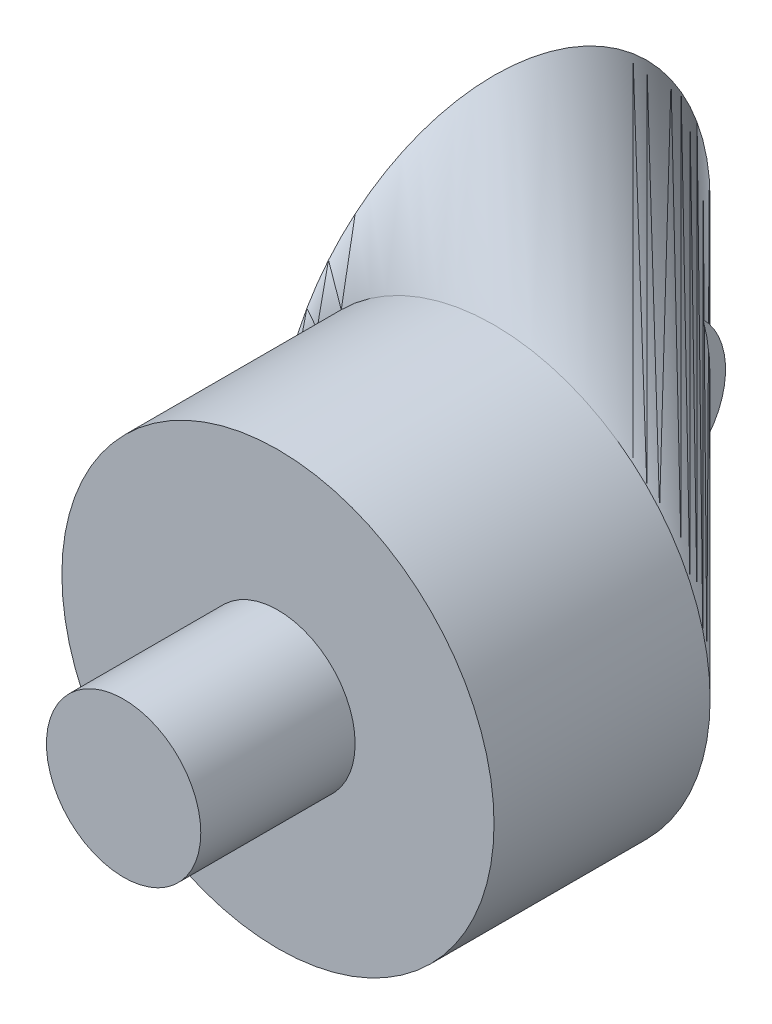
ISO-10303-21;
HEADER;
FILE_DESCRIPTION(('STEP AP214'),'2;1');
FILE_NAME('part.step','',(''),(''),'','','');
FILE_SCHEMA(('AUTOMOTIVE_DESIGN { 1 0 10303 214 1 1 1 1 }'));
ENDSEC;
DATA;
#1=APPLICATION_CONTEXT('core data for automotive mechanical design processes');
#2=APPLICATION_PROTOCOL_DEFINITION('international standard','automotive_design',2000,#1);
#3=PRODUCT_CONTEXT('',#1,'mechanical');
#4=PRODUCT('Part','Part','',(#3));
#5=PRODUCT_RELATED_PRODUCT_CATEGORY('part','',(#4));
#6=PRODUCT_DEFINITION_FORMATION('','',#4);
#7=PRODUCT_DEFINITION_CONTEXT('part definition',#1,'design');
#8=PRODUCT_DEFINITION('design','',#6,#7);
#9=PRODUCT_DEFINITION_SHAPE('','',#8);
#10=(LENGTH_UNIT() NAMED_UNIT(*) SI_UNIT(.MILLI.,.METRE.));
#11=(NAMED_UNIT(*) PLANE_ANGLE_UNIT() SI_UNIT($,.RADIAN.));
#12=(NAMED_UNIT(*) SI_UNIT($,.STERADIAN.) SOLID_ANGLE_UNIT());
#13=UNCERTAINTY_MEASURE_WITH_UNIT(LENGTH_MEASURE(1.E-05),#10,'distance_accuracy_value','');
#14=(GEOMETRIC_REPRESENTATION_CONTEXT(3) GLOBAL_UNCERTAINTY_ASSIGNED_CONTEXT((#13)) GLOBAL_UNIT_ASSIGNED_CONTEXT((#10,
#11,#12)) REPRESENTATION_CONTEXT('',''));
#15=CARTESIAN_POINT('',(0.,0.,0.));
#16=DIRECTION('',(0.,0.,1.));
#17=DIRECTION('',(1.,0.,0.));
#18=AXIS2_PLACEMENT_3D('',#15,#16,#17);
#19=CARTESIAN_POINT('',(0.,0.,0.));
#20=DIRECTION('',(1.,0.,0.));
#21=DIRECTION('',(0.,0.,-1.));
#22=AXIS2_PLACEMENT_3D('',#19,#20,#21);
#23=PLANE('',#22);
#24=CARTESIAN_POINT('',(0.,0.,0.));
#25=DIRECTION('',(-1.,0.,0.));
#26=DIRECTION('',(0.,0.,1.));
#27=AXIS2_PLACEMENT_3D('',#24,#25,#26);
#28=CIRCLE('',#27,25.);
#29=CARTESIAN_POINT('',(0.,0.,25.));
#30=VERTEX_POINT('',#29);
#31=EDGE_CURVE('E56',#30,#30,#28,.T.);
#32=ORIENTED_EDGE('',*,*,#31,.F.);
#33=EDGE_LOOP('',(#32));
#34=FACE_BOUND('',#33,.T.);
#35=CARTESIAN_POINT('',(0.,0.,0.));
#36=DIRECTION('',(1.,0.,0.));
#37=DIRECTION('',(0.,0.,-1.));
#38=AXIS2_PLACEMENT_3D('',#35,#36,#37);
#39=CIRCLE('',#38,70.);
#40=CARTESIAN_POINT('',(0.,0.,70.));
#41=VERTEX_POINT('',#40);
#42=EDGE_CURVE('E42',#41,#41,#39,.T.);
#43=ORIENTED_EDGE('',*,*,#42,.F.);
#44=EDGE_LOOP('',(#43));
#45=FACE_BOUND('',#44,.T.);
#46=ADVANCED_FACE('F35',(#34,#45),#23,.F.);
#47=CARTESIAN_POINT('',(0.,0.,70.));
#48=DIRECTION('',(0.,1.,0.));
#49=DIRECTION('',(0.,0.,1.));
#50=AXIS2_PLACEMENT_3D('',#47,#48,#49);
#51=DEGENERATE_TOROIDAL_SURFACE('',#50,70.,70.,.T.);
#52=ORIENTED_EDGE('',*,*,#42,.T.);
#53=CARTESIAN_POINT('',(70.,0.,70.));
#54=DIRECTION('',(0.,0.,1.));
#55=DIRECTION('',(1.,0.,0.));
#56=AXIS2_PLACEMENT_3D('',#53,#54,#55);
#57=CIRCLE('',#56,70.);
#58=EDGE_CURVE('E49',#41,#41,#57,.T.);
#59=ORIENTED_EDGE('',*,*,#58,.F.);
#60=EDGE_LOOP('',(#52,#59));
#61=FACE_BOUND('',#60,.T.);
#62=ADVANCED_FACE('F87',(#61),#51,.T.);
#63=CARTESIAN_POINT('',(50.,0.,0.));
#64=DIRECTION('',(-1.,0.,0.));
#65=DIRECTION('',(0.,0.,1.));
#66=AXIS2_PLACEMENT_3D('',#63,#64,#65);
#67=CYLINDRICAL_SURFACE('',#66,25.);
#68=CARTESIAN_POINT('',(50.,0.,0.));
#69=DIRECTION('',(-1.,0.,0.));
#70=DIRECTION('',(0.,0.,1.));
#71=AXIS2_PLACEMENT_3D('',#68,#69,#70);
#72=CIRCLE('',#71,25.);
#73=CARTESIAN_POINT('',(50.,0.,25.));
#74=VERTEX_POINT('',#73);
#75=EDGE_CURVE('E51',#74,#74,#72,.T.);
#76=ORIENTED_EDGE('',*,*,#75,.F.);
#77=EDGE_LOOP('',(#76));
#78=FACE_BOUND('',#77,.T.);
#79=ORIENTED_EDGE('',*,*,#31,.T.);
#80=EDGE_LOOP('',(#79));
#81=FACE_BOUND('',#80,.T.);
#82=ADVANCED_FACE('F89',(#78,#81),#67,.F.);
#83=CARTESIAN_POINT('',(50.,0.,0.));
#84=DIRECTION('',(-1.,0.,0.));
#85=DIRECTION('',(0.,0.,1.));
#86=AXIS2_PLACEMENT_3D('',#83,#84,#85);
#87=PLANE('',#86);
#88=ORIENTED_EDGE('',*,*,#75,.T.);
#89=EDGE_LOOP('',(#88));
#90=FACE_BOUND('',#89,.T.);
#91=ADVANCED_FACE('F85',(#90),#87,.T.);
#92=CARTESIAN_POINT('',(70.,0.,140.));
#93=DIRECTION('',(0.,0.,-1.));
#94=DIRECTION('',(-1.,0.,0.));
#95=AXIS2_PLACEMENT_3D('',#92,#93,#94);
#96=CYLINDRICAL_SURFACE('',#95,70.);
#97=CARTESIAN_POINT('',(70.,0.,140.));
#98=DIRECTION('',(0.,0.,1.));
#99=DIRECTION('',(1.,0.,0.));
#100=AXIS2_PLACEMENT_3D('',#97,#98,#99);
#101=CIRCLE('',#100,70.);
#102=CARTESIAN_POINT('',(140.,0.,140.));
#103=VERTEX_POINT('',#102);
#104=EDGE_CURVE('E59',#103,#103,#101,.T.);
#105=ORIENTED_EDGE('',*,*,#104,.F.);
#106=EDGE_LOOP('',(#105));
#107=FACE_BOUND('',#106,.T.);
#108=ORIENTED_EDGE('',*,*,#58,.T.);
#109=EDGE_LOOP('',(#108));
#110=FACE_BOUND('',#109,.T.);
#111=ADVANCED_FACE('F79',(#107,#110),#96,.T.);
#112=CARTESIAN_POINT('',(70.,0.,140.));
#113=DIRECTION('',(0.,0.,1.));
#114=DIRECTION('',(1.,0.,0.));
#115=AXIS2_PLACEMENT_3D('',#112,#113,#114);
#116=PLANE('',#115);
#117=CARTESIAN_POINT('',(70.,0.,140.));
#118=DIRECTION('',(0.,0.,1.));
#119=DIRECTION('',(1.,0.,0.));
#120=AXIS2_PLACEMENT_3D('',#117,#118,#119);
#121=CIRCLE('',#120,25.);
#122=CARTESIAN_POINT('',(95.,0.,140.));
#123=VERTEX_POINT('',#122);
#124=EDGE_CURVE('E11',#123,#123,#121,.T.);
#125=ORIENTED_EDGE('',*,*,#124,.F.);
#126=EDGE_LOOP('',(#125));
#127=FACE_BOUND('',#126,.T.);
#128=ORIENTED_EDGE('',*,*,#104,.T.);
#129=EDGE_LOOP('',(#128));
#130=FACE_BOUND('',#129,.T.);
#131=ADVANCED_FACE('F73',(#127,#130),#116,.T.);
#132=CARTESIAN_POINT('',(70.,0.,190.));
#133=DIRECTION('',(0.,0.,-1.));
#134=DIRECTION('',(-1.,0.,0.));
#135=AXIS2_PLACEMENT_3D('',#132,#133,#134);
#136=CYLINDRICAL_SURFACE('',#135,25.);
#137=CARTESIAN_POINT('',(70.,0.,190.));
#138=DIRECTION('',(0.,0.,1.));
#139=DIRECTION('',(1.,0.,0.));
#140=AXIS2_PLACEMENT_3D('',#137,#138,#139);
#141=CIRCLE('',#140,25.);
#142=CARTESIAN_POINT('',(95.,0.,190.));
#143=VERTEX_POINT('',#142);
#144=EDGE_CURVE('E63',#143,#143,#141,.T.);
#145=ORIENTED_EDGE('',*,*,#144,.F.);
#146=EDGE_LOOP('',(#145));
#147=FACE_BOUND('',#146,.T.);
#148=ORIENTED_EDGE('',*,*,#124,.T.);
#149=EDGE_LOOP('',(#148));
#150=FACE_BOUND('',#149,.T.);
#151=ADVANCED_FACE('F70',(#147,#150),#136,.T.);
#152=CARTESIAN_POINT('',(70.,0.,190.));
#153=DIRECTION('',(0.,0.,1.));
#154=DIRECTION('',(1.,0.,0.));
#155=AXIS2_PLACEMENT_3D('',#152,#153,#154);
#156=PLANE('',#155);
#157=ORIENTED_EDGE('',*,*,#144,.T.);
#158=EDGE_LOOP('',(#157));
#159=FACE_BOUND('',#158,.T.);
#160=ADVANCED_FACE('F68',(#159),#156,.T.);
#161=CLOSED_SHELL('',(#46,#62,#82,#91,#111,#131,#151,#160));
#162=MANIFOLD_SOLID_BREP('B2',#161);
#163=ADVANCED_BREP_SHAPE_REPRESENTATION('',(#18,#162),#14);
#164=SHAPE_DEFINITION_REPRESENTATION(#9,#163);
ENDSEC;
END-ISO-10303-21;
